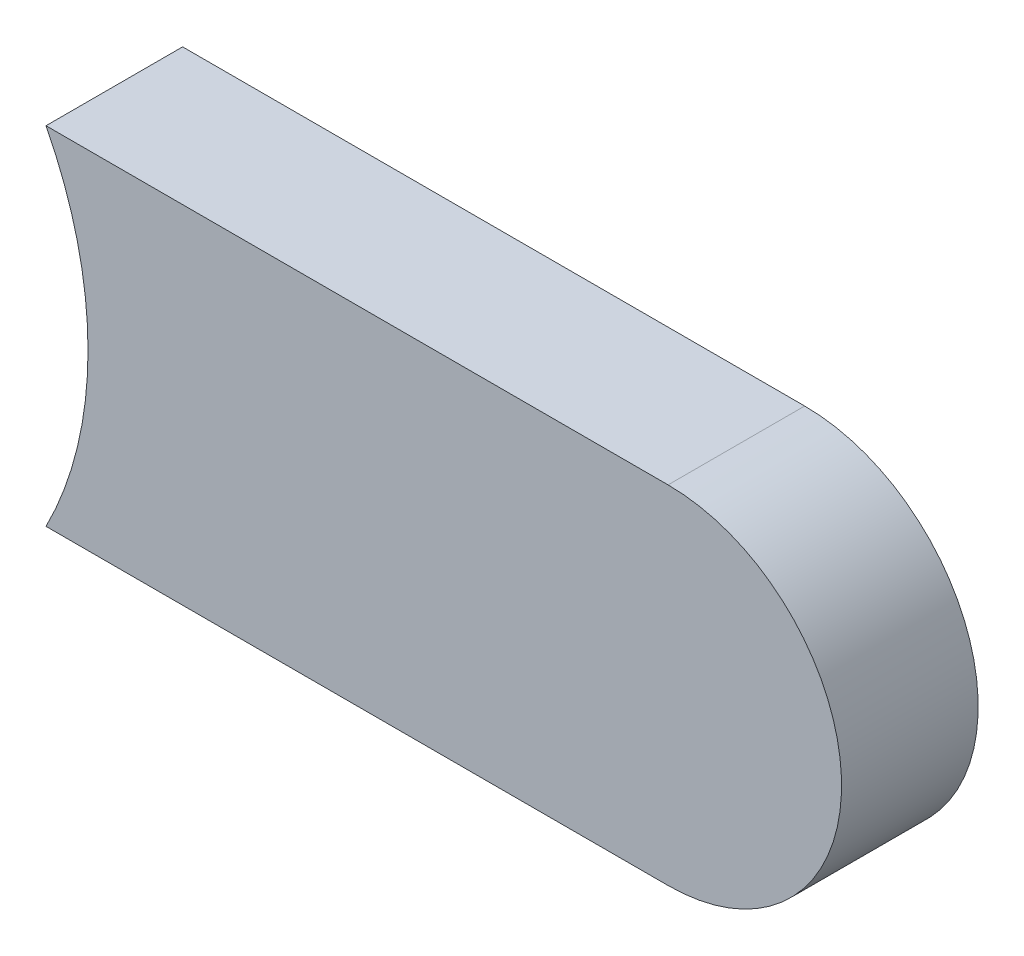
ISO-10303-21;
HEADER;
FILE_DESCRIPTION(('STEP AP214'),'2;1');
FILE_NAME('part.step','',(''),(''),'','','');
FILE_SCHEMA(('AUTOMOTIVE_DESIGN { 1 0 10303 214 1 1 1 1 }'));
ENDSEC;
DATA;
#1=APPLICATION_CONTEXT('core data for automotive mechanical design processes');
#2=APPLICATION_PROTOCOL_DEFINITION('international standard','automotive_design',2000,#1);
#3=PRODUCT_CONTEXT('',#1,'mechanical');
#4=PRODUCT('Part','Part','',(#3));
#5=PRODUCT_RELATED_PRODUCT_CATEGORY('part','',(#4));
#6=PRODUCT_DEFINITION_FORMATION('','',#4);
#7=PRODUCT_DEFINITION_CONTEXT('part definition',#1,'design');
#8=PRODUCT_DEFINITION('design','',#6,#7);
#9=PRODUCT_DEFINITION_SHAPE('','',#8);
#10=(LENGTH_UNIT() NAMED_UNIT(*) SI_UNIT(.MILLI.,.METRE.));
#11=(NAMED_UNIT(*) PLANE_ANGLE_UNIT() SI_UNIT($,.RADIAN.));
#12=(NAMED_UNIT(*) SI_UNIT($,.STERADIAN.) SOLID_ANGLE_UNIT());
#13=UNCERTAINTY_MEASURE_WITH_UNIT(LENGTH_MEASURE(1.E-05),#10,'distance_accuracy_value','');
#14=(GEOMETRIC_REPRESENTATION_CONTEXT(3) GLOBAL_UNCERTAINTY_ASSIGNED_CONTEXT((#13)) GLOBAL_UNIT_ASSIGNED_CONTEXT((#10,
#11,#12)) REPRESENTATION_CONTEXT('',''));
#15=CARTESIAN_POINT('',(0.,0.,0.));
#16=DIRECTION('',(0.,0.,1.));
#17=DIRECTION('',(1.,0.,0.));
#18=AXIS2_PLACEMENT_3D('',#15,#16,#17);
#19=CARTESIAN_POINT('',(129.518202090858,93.345,0.));
#20=DIRECTION('',(0.,1.,0.));
#21=DIRECTION('',(1.,0.,0.));
#22=AXIS2_PLACEMENT_3D('',#19,#20,#21);
#23=PLANE('',#22);
#24=DIRECTION('',(1.,0.,0.));
#25=VECTOR('',#24,1.);
#26=CARTESIAN_POINT('',(129.0247356,93.345,0.1999996));
#27=LINE('',#26,#25);
#28=CARTESIAN_POINT('',(129.518202090858,93.345,0.1999996));
#29=VERTEX_POINT('',#28);
#30=CARTESIAN_POINT('',(130.429,93.345,0.1999996));
#31=VERTEX_POINT('',#30);
#32=EDGE_CURVE('E11',#29,#31,#27,.T.);
#33=ORIENTED_EDGE('',*,*,#32,.F.);
#34=DIRECTION('',(0.,0.,1.));
#35=VECTOR('',#34,1.);
#36=CARTESIAN_POINT('',(129.518202090858,93.345,0.));
#37=LINE('',#36,#35);
#38=CARTESIAN_POINT('',(129.518202090858,93.345,0.));
#39=VERTEX_POINT('',#38);
#40=EDGE_CURVE('E24',#39,#29,#37,.T.);
#41=ORIENTED_EDGE('',*,*,#40,.F.);
#42=DIRECTION('',(1.,0.,0.));
#43=VECTOR('',#42,1.);
#44=CARTESIAN_POINT('',(129.0247356,93.345,0.));
#45=LINE('',#44,#43);
#46=CARTESIAN_POINT('',(130.429,93.345,0.));
#47=VERTEX_POINT('',#46);
#48=EDGE_CURVE('E82',#39,#47,#45,.T.);
#49=ORIENTED_EDGE('',*,*,#48,.T.);
#50=DIRECTION('',(0.,0.,1.));
#51=VECTOR('',#50,1.);
#52=CARTESIAN_POINT('',(130.429,93.345,0.));
#53=LINE('',#52,#51);
#54=EDGE_CURVE('E37',#47,#31,#53,.T.);
#55=ORIENTED_EDGE('',*,*,#54,.T.);
#56=EDGE_LOOP('',(#33,#41,#49,#55));
#57=FACE_BOUND('',#56,.T.);
#58=ADVANCED_FACE('F17',(#57),#23,.F.);
#59=CARTESIAN_POINT('',(130.429,93.599,0.));
#60=DIRECTION('',(0.,0.,-1.));
#61=DIRECTION('',(1.11896493820486E-13,-1.,0.));
#62=AXIS2_PLACEMENT_3D('',#59,#60,#61);
#63=CYLINDRICAL_SURFACE('',#62,0.254000000000005);
#64=CARTESIAN_POINT('',(130.429,93.599,0.1999996));
#65=DIRECTION('',(0.,0.,1.));
#66=DIRECTION('',(1.11896493820486E-13,-1.,0.));
#67=AXIS2_PLACEMENT_3D('',#64,#65,#66);
#68=CIRCLE('',#67,0.254000000000005);
#69=CARTESIAN_POINT('',(130.429,93.853,0.1999996));
#70=VERTEX_POINT('',#69);
#71=EDGE_CURVE('E97',#31,#70,#68,.T.);
#72=ORIENTED_EDGE('',*,*,#71,.F.);
#73=ORIENTED_EDGE('',*,*,#54,.F.);
#74=CARTESIAN_POINT('',(130.429,93.599,0.));
#75=DIRECTION('',(0.,0.,1.));
#76=DIRECTION('',(1.11896493820486E-13,-1.,0.));
#77=AXIS2_PLACEMENT_3D('',#74,#75,#76);
#78=CIRCLE('',#77,0.254000000000005);
#79=CARTESIAN_POINT('',(130.429,93.853,0.));
#80=VERTEX_POINT('',#79);
#81=EDGE_CURVE('E94',#47,#80,#78,.T.);
#82=ORIENTED_EDGE('',*,*,#81,.T.);
#83=DIRECTION('',(0.,0.,1.));
#84=VECTOR('',#83,1.);
#85=CARTESIAN_POINT('',(130.429,93.853,0.));
#86=LINE('',#85,#84);
#87=EDGE_CURVE('E92',#80,#70,#86,.T.);
#88=ORIENTED_EDGE('',*,*,#87,.T.);
#89=EDGE_LOOP('',(#72,#73,#82,#88));
#90=FACE_BOUND('',#89,.T.);
#91=ADVANCED_FACE('F103',(#90),#63,.T.);
#92=CARTESIAN_POINT('',(130.429,93.853,0.));
#93=DIRECTION('',(0.,-1.,0.));
#94=DIRECTION('',(-1.,0.,0.));
#95=AXIS2_PLACEMENT_3D('',#92,#93,#94);
#96=PLANE('',#95);
#97=DIRECTION('',(-1.,0.,0.));
#98=VECTOR('',#97,1.);
#99=CARTESIAN_POINT('',(130.429,93.853,0.1999996));
#100=LINE('',#99,#98);
#101=CARTESIAN_POINT('',(129.518202090858,93.853,0.1999996));
#102=VERTEX_POINT('',#101);
#103=EDGE_CURVE('E89',#70,#102,#100,.T.);
#104=ORIENTED_EDGE('',*,*,#103,.F.);
#105=ORIENTED_EDGE('',*,*,#87,.F.);
#106=DIRECTION('',(-1.,0.,0.));
#107=VECTOR('',#106,1.);
#108=CARTESIAN_POINT('',(130.429,93.853,0.));
#109=LINE('',#108,#107);
#110=CARTESIAN_POINT('',(129.518202090858,93.853,0.));
#111=VERTEX_POINT('',#110);
#112=EDGE_CURVE('E87',#80,#111,#109,.T.);
#113=ORIENTED_EDGE('',*,*,#112,.T.);
#114=DIRECTION('',(0.,0.,1.));
#115=VECTOR('',#114,1.);
#116=CARTESIAN_POINT('',(129.518202090858,93.853,0.));
#117=LINE('',#116,#115);
#118=EDGE_CURVE('E69',#111,#102,#117,.T.);
#119=ORIENTED_EDGE('',*,*,#118,.T.);
#120=EDGE_LOOP('',(#104,#105,#113,#119));
#121=FACE_BOUND('',#120,.T.);
#122=ADVANCED_FACE('F108',(#121),#96,.F.);
#123=CARTESIAN_POINT('',(129.0247356,93.599,0.));
#124=DIRECTION('',(0.,0.,-1.));
#125=DIRECTION('',(1.,0.,0.));
#126=AXIS2_PLACEMENT_3D('',#123,#124,#125);
#127=CYLINDRICAL_SURFACE('',#126,0.55500016);
#128=DIRECTION('',(0.,0.,1.));
#129=VECTOR('',#128,1.);
#130=CARTESIAN_POINT('',(129.57973576,93.599,0.));
#131=LINE('',#130,#129);
#132=CARTESIAN_POINT('',(129.57973576,93.599,0.));
#133=VERTEX_POINT('',#132);
#134=CARTESIAN_POINT('',(129.57973576,93.599,0.1999996));
#135=VERTEX_POINT('',#134);
#136=EDGE_CURVE('E59',#133,#135,#131,.T.);
#137=ORIENTED_EDGE('',*,*,#136,.T.);
#138=CARTESIAN_POINT('',(129.0247356,93.599,0.1999996));
#139=DIRECTION('',(0.,0.,1.));
#140=DIRECTION('',(1.,0.,0.));
#141=AXIS2_PLACEMENT_3D('',#138,#139,#140);
#142=CIRCLE('',#141,0.55500016);
#143=EDGE_CURVE('E70',#135,#102,#142,.T.);
#144=ORIENTED_EDGE('',*,*,#143,.T.);
#145=ORIENTED_EDGE('',*,*,#118,.F.);
#146=CARTESIAN_POINT('',(129.0247356,93.599,0.));
#147=DIRECTION('',(0.,0.,1.));
#148=DIRECTION('',(1.,0.,0.));
#149=AXIS2_PLACEMENT_3D('',#146,#147,#148);
#150=CIRCLE('',#149,0.55500016);
#151=EDGE_CURVE('E73',#133,#111,#150,.T.);
#152=ORIENTED_EDGE('',*,*,#151,.F.);
#153=EDGE_LOOP('',(#137,#144,#145,#152));
#154=FACE_BOUND('',#153,.T.);
#155=ADVANCED_FACE('F74',(#154),#127,.F.);
#156=CARTESIAN_POINT('',(129.0247356,93.599,0.));
#157=DIRECTION('',(0.,0.,-1.));
#158=DIRECTION('',(1.,0.,0.));
#159=AXIS2_PLACEMENT_3D('',#156,#157,#158);
#160=CYLINDRICAL_SURFACE('',#159,0.55500016);
#161=ORIENTED_EDGE('',*,*,#40,.T.);
#162=CARTESIAN_POINT('',(129.0247356,93.599,0.1999996));
#163=DIRECTION('',(0.,0.,1.));
#164=DIRECTION('',(1.,0.,0.));
#165=AXIS2_PLACEMENT_3D('',#162,#163,#164);
#166=CIRCLE('',#165,0.55500016);
#167=EDGE_CURVE('E65',#29,#135,#166,.T.);
#168=ORIENTED_EDGE('',*,*,#167,.T.);
#169=ORIENTED_EDGE('',*,*,#136,.F.);
#170=EDGE_CURVE('E63',#39,#133,#150,.T.);
#171=ORIENTED_EDGE('',*,*,#170,.F.);
#172=EDGE_LOOP('',(#161,#168,#169,#171));
#173=FACE_BOUND('',#172,.T.);
#174=ADVANCED_FACE('F61',(#173),#160,.F.);
#175=CARTESIAN_POINT('',(129.0247356,93.345,0.));
#176=DIRECTION('',(0.,0.,-1.));
#177=DIRECTION('',(-1.,0.,0.));
#178=AXIS2_PLACEMENT_3D('',#175,#176,#177);
#179=PLANE('',#178);
#180=ORIENTED_EDGE('',*,*,#48,.F.);
#181=ORIENTED_EDGE('',*,*,#170,.T.);
#182=ORIENTED_EDGE('',*,*,#151,.T.);
#183=ORIENTED_EDGE('',*,*,#112,.F.);
#184=ORIENTED_EDGE('',*,*,#81,.F.);
#185=EDGE_LOOP('',(#180,#181,#182,#183,#184));
#186=FACE_BOUND('',#185,.T.);
#187=ADVANCED_FACE('F80',(#186),#179,.T.);
#188=CARTESIAN_POINT('',(129.0247356,93.345,0.1999996));
#189=DIRECTION('',(0.,0.,-1.));
#190=DIRECTION('',(-1.,0.,0.));
#191=AXIS2_PLACEMENT_3D('',#188,#189,#190);
#192=PLANE('',#191);
#193=ORIENTED_EDGE('',*,*,#167,.F.);
#194=ORIENTED_EDGE('',*,*,#32,.T.);
#195=ORIENTED_EDGE('',*,*,#71,.T.);
#196=ORIENTED_EDGE('',*,*,#103,.T.);
#197=ORIENTED_EDGE('',*,*,#143,.F.);
#198=EDGE_LOOP('',(#193,#194,#195,#196,#197));
#199=FACE_BOUND('',#198,.T.);
#200=ADVANCED_FACE('F106',(#199),#192,.F.);
#201=CLOSED_SHELL('',(#58,#91,#122,#155,#174,#187,#200));
#202=MANIFOLD_SOLID_BREP('B1',#201);
#203=ADVANCED_BREP_SHAPE_REPRESENTATION('',(#18,#202),#14);
#204=SHAPE_DEFINITION_REPRESENTATION(#9,#203);
ENDSEC;
END-ISO-10303-21;
